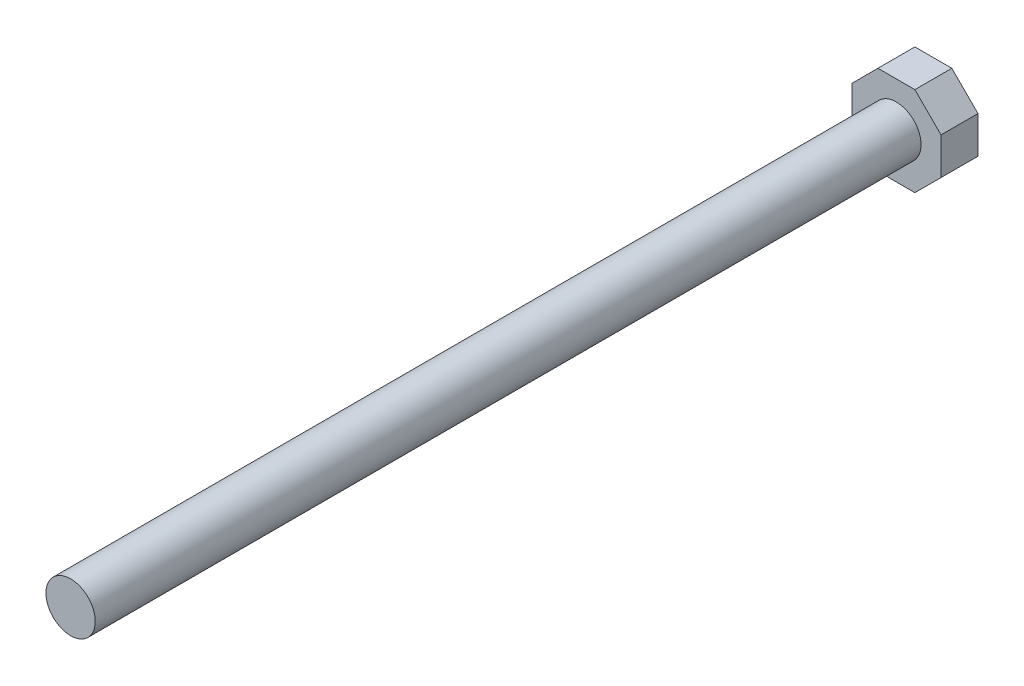
ISO-10303-21;
HEADER;
FILE_DESCRIPTION(('STEP AP214'),'2;1');
FILE_NAME('part.step','',(''),(''),'','','');
FILE_SCHEMA(('AUTOMOTIVE_DESIGN { 1 0 10303 214 1 1 1 1 }'));
ENDSEC;
DATA;
#1=APPLICATION_CONTEXT('core data for automotive mechanical design processes');
#2=APPLICATION_PROTOCOL_DEFINITION('international standard','automotive_design',2000,#1);
#3=PRODUCT_CONTEXT('',#1,'mechanical');
#4=PRODUCT('Part','Part','',(#3));
#5=PRODUCT_RELATED_PRODUCT_CATEGORY('part','',(#4));
#6=PRODUCT_DEFINITION_FORMATION('','',#4);
#7=PRODUCT_DEFINITION_CONTEXT('part definition',#1,'design');
#8=PRODUCT_DEFINITION('design','',#6,#7);
#9=PRODUCT_DEFINITION_SHAPE('','',#8);
#10=(LENGTH_UNIT() NAMED_UNIT(*) SI_UNIT(.MILLI.,.METRE.));
#11=(NAMED_UNIT(*) PLANE_ANGLE_UNIT() SI_UNIT($,.RADIAN.));
#12=(NAMED_UNIT(*) SI_UNIT($,.STERADIAN.) SOLID_ANGLE_UNIT());
#13=UNCERTAINTY_MEASURE_WITH_UNIT(LENGTH_MEASURE(1.E-05),#10,'distance_accuracy_value','');
#14=(GEOMETRIC_REPRESENTATION_CONTEXT(3) GLOBAL_UNCERTAINTY_ASSIGNED_CONTEXT((#13)) GLOBAL_UNIT_ASSIGNED_CONTEXT((#10,
#11,#12)) REPRESENTATION_CONTEXT('',''));
#15=CARTESIAN_POINT('',(0.,0.,0.));
#16=DIRECTION('',(0.,0.,1.));
#17=DIRECTION('',(1.,0.,0.));
#18=AXIS2_PLACEMENT_3D('',#15,#16,#17);
#19=CARTESIAN_POINT('',(-1.77703987317861,-2.71481784594583,3.));
#20=DIRECTION('',(1.,0.,0.));
#21=DIRECTION('',(0.,0.,-1.));
#22=AXIS2_PLACEMENT_3D('',#19,#20,#21);
#23=PLANE('',#22);
#24=DIRECTION('',(0.,-1.,0.));
#25=VECTOR('',#24,1.);
#26=CARTESIAN_POINT('',(-1.77703987317861,-2.71481784594583,0.));
#27=LINE('',#26,#25);
#28=CARTESIAN_POINT('',(-1.77703987317861,0.28518215405417,0.));
#29=VERTEX_POINT('',#28);
#30=CARTESIAN_POINT('',(-1.77703987317861,-2.71481784594583,0.));
#31=VERTEX_POINT('',#30);
#32=EDGE_CURVE('E131',#29,#31,#27,.T.);
#33=ORIENTED_EDGE('',*,*,#32,.T.);
#34=DIRECTION('',(0.,0.,-1.));
#35=VECTOR('',#34,1.);
#36=CARTESIAN_POINT('',(-1.77703987317861,-2.71481784594583,3.));
#37=LINE('',#36,#35);
#38=CARTESIAN_POINT('',(-1.77703987317861,-2.71481784594583,3.));
#39=VERTEX_POINT('',#38);
#40=EDGE_CURVE('E36',#39,#31,#37,.T.);
#41=ORIENTED_EDGE('',*,*,#40,.F.);
#42=DIRECTION('',(0.,-1.,0.));
#43=VECTOR('',#42,1.);
#44=CARTESIAN_POINT('',(-1.77703987317861,-2.71481784594583,3.));
#45=LINE('',#44,#43);
#46=CARTESIAN_POINT('',(-1.77703987317861,0.28518215405417,3.));
#47=VERTEX_POINT('',#46);
#48=EDGE_CURVE('E146',#47,#39,#45,.T.);
#49=ORIENTED_EDGE('',*,*,#48,.F.);
#50=DIRECTION('',(0.,0.,-1.));
#51=VECTOR('',#50,1.);
#52=CARTESIAN_POINT('',(-1.77703987317861,0.28518215405417,3.));
#53=LINE('',#52,#51);
#54=EDGE_CURVE('E127',#47,#29,#53,.T.);
#55=ORIENTED_EDGE('',*,*,#54,.T.);
#56=EDGE_LOOP('',(#33,#41,#49,#55));
#57=FACE_BOUND('',#56,.T.);
#58=ADVANCED_FACE('F33',(#57),#23,.F.);
#59=CARTESIAN_POINT('',(0.34428047038103,-4.83613818950547,3.));
#60=DIRECTION('',(0.707106781186547,0.707106781186547,0.));
#61=DIRECTION('',(-0.707106781186548,0.707106781186548,0.));
#62=AXIS2_PLACEMENT_3D('',#59,#60,#61);
#63=PLANE('',#62);
#64=DIRECTION('',(0.707106781186548,-0.707106781186548,0.));
#65=VECTOR('',#64,1.);
#66=CARTESIAN_POINT('',(0.34428047038103,-4.83613818950547,0.));
#67=LINE('',#66,#65);
#68=CARTESIAN_POINT('',(0.34428047038103,-4.83613818950547,0.));
#69=VERTEX_POINT('',#68);
#70=EDGE_CURVE('E134',#31,#69,#67,.T.);
#71=ORIENTED_EDGE('',*,*,#70,.T.);
#72=DIRECTION('',(0.,0.,-1.));
#73=VECTOR('',#72,1.);
#74=CARTESIAN_POINT('',(0.34428047038103,-4.83613818950547,3.));
#75=LINE('',#74,#73);
#76=CARTESIAN_POINT('',(0.34428047038103,-4.83613818950547,3.));
#77=VERTEX_POINT('',#76);
#78=EDGE_CURVE('E155',#77,#69,#75,.T.);
#79=ORIENTED_EDGE('',*,*,#78,.F.);
#80=DIRECTION('',(0.707106781186548,-0.707106781186548,0.));
#81=VECTOR('',#80,1.);
#82=CARTESIAN_POINT('',(0.34428047038103,-4.83613818950547,3.));
#83=LINE('',#82,#81);
#84=EDGE_CURVE('E94',#39,#77,#83,.T.);
#85=ORIENTED_EDGE('',*,*,#84,.F.);
#86=ORIENTED_EDGE('',*,*,#40,.T.);
#87=EDGE_LOOP('',(#71,#79,#85,#86));
#88=FACE_BOUND('',#87,.T.);
#89=ADVANCED_FACE('F161',(#88),#63,.F.);
#90=CARTESIAN_POINT('',(3.34428047038103,-4.83613818950547,3.));
#91=DIRECTION('',(0.,1.,0.));
#92=DIRECTION('',(0.,0.,1.));
#93=AXIS2_PLACEMENT_3D('',#90,#91,#92);
#94=PLANE('',#93);
#95=DIRECTION('',(1.,0.,0.));
#96=VECTOR('',#95,1.);
#97=CARTESIAN_POINT('',(3.34428047038103,-4.83613818950547,0.));
#98=LINE('',#97,#96);
#99=CARTESIAN_POINT('',(3.34428047038103,-4.83613818950547,0.));
#100=VERTEX_POINT('',#99);
#101=EDGE_CURVE('E137',#69,#100,#98,.T.);
#102=ORIENTED_EDGE('',*,*,#101,.T.);
#103=DIRECTION('',(0.,0.,-1.));
#104=VECTOR('',#103,1.);
#105=CARTESIAN_POINT('',(3.34428047038103,-4.83613818950547,3.));
#106=LINE('',#105,#104);
#107=CARTESIAN_POINT('',(3.34428047038103,-4.83613818950547,3.));
#108=VERTEX_POINT('',#107);
#109=EDGE_CURVE('E153',#108,#100,#106,.T.);
#110=ORIENTED_EDGE('',*,*,#109,.F.);
#111=DIRECTION('',(1.,0.,0.));
#112=VECTOR('',#111,1.);
#113=CARTESIAN_POINT('',(3.34428047038103,-4.83613818950547,3.));
#114=LINE('',#113,#112);
#115=EDGE_CURVE('E176',#77,#108,#114,.T.);
#116=ORIENTED_EDGE('',*,*,#115,.F.);
#117=ORIENTED_EDGE('',*,*,#78,.T.);
#118=EDGE_LOOP('',(#102,#110,#116,#117));
#119=FACE_BOUND('',#118,.T.);
#120=ADVANCED_FACE('F170',(#119),#94,.F.);
#121=CARTESIAN_POINT('',(5.46560081394067,-2.71481784594583,3.));
#122=DIRECTION('',(-0.707106781186548,0.707106781186547,0.));
#123=DIRECTION('',(-0.707106781186547,-0.707106781186548,0.));
#124=AXIS2_PLACEMENT_3D('',#121,#122,#123);
#125=PLANE('',#124);
#126=DIRECTION('',(0.707106781186547,0.707106781186548,0.));
#127=VECTOR('',#126,1.);
#128=CARTESIAN_POINT('',(5.46560081394067,-2.71481784594583,0.));
#129=LINE('',#128,#127);
#130=CARTESIAN_POINT('',(5.46560081394067,-2.71481784594583,0.));
#131=VERTEX_POINT('',#130);
#132=EDGE_CURVE('E139',#100,#131,#129,.T.);
#133=ORIENTED_EDGE('',*,*,#132,.T.);
#134=DIRECTION('',(0.,0.,-1.));
#135=VECTOR('',#134,1.);
#136=CARTESIAN_POINT('',(5.46560081394067,-2.71481784594583,3.));
#137=LINE('',#136,#135);
#138=CARTESIAN_POINT('',(5.46560081394067,-2.71481784594583,3.));
#139=VERTEX_POINT('',#138);
#140=EDGE_CURVE('E150',#139,#131,#137,.T.);
#141=ORIENTED_EDGE('',*,*,#140,.F.);
#142=DIRECTION('',(0.707106781186547,0.707106781186548,0.));
#143=VECTOR('',#142,1.);
#144=CARTESIAN_POINT('',(5.46560081394067,-2.71481784594583,3.));
#145=LINE('',#144,#143);
#146=EDGE_CURVE('E175',#108,#139,#145,.T.);
#147=ORIENTED_EDGE('',*,*,#146,.F.);
#148=ORIENTED_EDGE('',*,*,#109,.T.);
#149=EDGE_LOOP('',(#133,#141,#147,#148));
#150=FACE_BOUND('',#149,.T.);
#151=ADVANCED_FACE('F173',(#150),#125,.F.);
#152=CARTESIAN_POINT('',(5.46560081394067,0.285182154054171,3.));
#153=DIRECTION('',(-1.,0.,0.));
#154=DIRECTION('',(0.,0.,1.));
#155=AXIS2_PLACEMENT_3D('',#152,#153,#154);
#156=PLANE('',#155);
#157=DIRECTION('',(0.,1.,0.));
#158=VECTOR('',#157,1.);
#159=CARTESIAN_POINT('',(5.46560081394067,0.285182154054171,0.));
#160=LINE('',#159,#158);
#161=CARTESIAN_POINT('',(5.46560081394067,0.285182154054171,0.));
#162=VERTEX_POINT('',#161);
#163=EDGE_CURVE('E141',#131,#162,#160,.T.);
#164=ORIENTED_EDGE('',*,*,#163,.T.);
#165=DIRECTION('',(0.,0.,-1.));
#166=VECTOR('',#165,1.);
#167=CARTESIAN_POINT('',(5.46560081394067,0.285182154054171,3.));
#168=LINE('',#167,#166);
#169=CARTESIAN_POINT('',(5.46560081394067,0.285182154054171,3.));
#170=VERTEX_POINT('',#169);
#171=EDGE_CURVE('E122',#170,#162,#168,.T.);
#172=ORIENTED_EDGE('',*,*,#171,.F.);
#173=DIRECTION('',(0.,1.,0.));
#174=VECTOR('',#173,1.);
#175=CARTESIAN_POINT('',(5.46560081394067,0.285182154054171,3.));
#176=LINE('',#175,#174);
#177=EDGE_CURVE('E113',#139,#170,#176,.T.);
#178=ORIENTED_EDGE('',*,*,#177,.F.);
#179=ORIENTED_EDGE('',*,*,#140,.T.);
#180=EDGE_LOOP('',(#164,#172,#178,#179));
#181=FACE_BOUND('',#180,.T.);
#182=ADVANCED_FACE('F213',(#181),#156,.F.);
#183=CARTESIAN_POINT('',(3.34428047038103,2.40650249761381,3.));
#184=DIRECTION('',(-0.707106781186548,-0.707106781186547,0.));
#185=DIRECTION('',(0.707106781186547,-0.707106781186548,0.));
#186=AXIS2_PLACEMENT_3D('',#183,#184,#185);
#187=PLANE('',#186);
#188=DIRECTION('',(-0.707106781186547,0.707106781186548,0.));
#189=VECTOR('',#188,1.);
#190=CARTESIAN_POINT('',(3.34428047038103,2.40650249761381,0.));
#191=LINE('',#190,#189);
#192=CARTESIAN_POINT('',(3.34428047038103,2.40650249761381,0.));
#193=VERTEX_POINT('',#192);
#194=EDGE_CURVE('E121',#162,#193,#191,.T.);
#195=ORIENTED_EDGE('',*,*,#194,.T.);
#196=DIRECTION('',(0.,0.,-1.));
#197=VECTOR('',#196,1.);
#198=CARTESIAN_POINT('',(3.34428047038103,2.40650249761381,3.));
#199=LINE('',#198,#197);
#200=CARTESIAN_POINT('',(3.34428047038103,2.40650249761381,3.));
#201=VERTEX_POINT('',#200);
#202=EDGE_CURVE('E118',#201,#193,#199,.T.);
#203=ORIENTED_EDGE('',*,*,#202,.F.);
#204=DIRECTION('',(-0.707106781186547,0.707106781186548,0.));
#205=VECTOR('',#204,1.);
#206=CARTESIAN_POINT('',(3.34428047038103,2.40650249761381,3.));
#207=LINE('',#206,#205);
#208=EDGE_CURVE('E107',#170,#201,#207,.T.);
#209=ORIENTED_EDGE('',*,*,#208,.F.);
#210=ORIENTED_EDGE('',*,*,#171,.T.);
#211=EDGE_LOOP('',(#195,#203,#209,#210));
#212=FACE_BOUND('',#211,.T.);
#213=ADVANCED_FACE('F119',(#212),#187,.F.);
#214=CARTESIAN_POINT('',(0.34428047038103,2.40650249761381,3.));
#215=DIRECTION('',(0.,-1.,0.));
#216=DIRECTION('',(0.,0.,-1.));
#217=AXIS2_PLACEMENT_3D('',#214,#215,#216);
#218=PLANE('',#217);
#219=DIRECTION('',(-1.,0.,0.));
#220=VECTOR('',#219,1.);
#221=CARTESIAN_POINT('',(0.34428047038103,2.40650249761381,0.));
#222=LINE('',#221,#220);
#223=CARTESIAN_POINT('',(0.34428047038103,2.40650249761381,0.));
#224=VERTEX_POINT('',#223);
#225=EDGE_CURVE('E79',#193,#224,#222,.T.);
#226=ORIENTED_EDGE('',*,*,#225,.T.);
#227=DIRECTION('',(0.,0.,-1.));
#228=VECTOR('',#227,1.);
#229=CARTESIAN_POINT('',(0.34428047038103,2.40650249761381,3.));
#230=LINE('',#229,#228);
#231=CARTESIAN_POINT('',(0.34428047038103,2.40650249761381,3.));
#232=VERTEX_POINT('',#231);
#233=EDGE_CURVE('E123',#232,#224,#230,.T.);
#234=ORIENTED_EDGE('',*,*,#233,.F.);
#235=DIRECTION('',(-1.,0.,0.));
#236=VECTOR('',#235,1.);
#237=CARTESIAN_POINT('',(0.34428047038103,2.40650249761381,3.));
#238=LINE('',#237,#236);
#239=EDGE_CURVE('E111',#201,#232,#238,.T.);
#240=ORIENTED_EDGE('',*,*,#239,.F.);
#241=ORIENTED_EDGE('',*,*,#202,.T.);
#242=EDGE_LOOP('',(#226,#234,#240,#241));
#243=FACE_BOUND('',#242,.T.);
#244=ADVANCED_FACE('F125',(#243),#218,.F.);
#245=CARTESIAN_POINT('',(-1.77703987317861,0.28518215405417,3.));
#246=DIRECTION('',(0.707106781186548,-0.707106781186547,0.));
#247=DIRECTION('',(0.707106781186547,0.707106781186548,0.));
#248=AXIS2_PLACEMENT_3D('',#245,#246,#247);
#249=PLANE('',#248);
#250=DIRECTION('',(-0.707106781186547,-0.707106781186548,0.));
#251=VECTOR('',#250,1.);
#252=CARTESIAN_POINT('',(-1.77703987317861,0.28518215405417,0.));
#253=LINE('',#252,#251);
#254=EDGE_CURVE('E85',#224,#29,#253,.T.);
#255=ORIENTED_EDGE('',*,*,#254,.T.);
#256=ORIENTED_EDGE('',*,*,#54,.F.);
#257=DIRECTION('',(-0.707106781186547,-0.707106781186548,0.));
#258=VECTOR('',#257,1.);
#259=CARTESIAN_POINT('',(-1.77703987317861,0.28518215405417,3.));
#260=LINE('',#259,#258);
#261=EDGE_CURVE('E50',#232,#47,#260,.T.);
#262=ORIENTED_EDGE('',*,*,#261,.F.);
#263=ORIENTED_EDGE('',*,*,#233,.T.);
#264=EDGE_LOOP('',(#255,#256,#262,#263));
#265=FACE_BOUND('',#264,.T.);
#266=ADVANCED_FACE('F194',(#265),#249,.F.);
#267=CARTESIAN_POINT('',(0.,0.,3.));
#268=DIRECTION('',(0.,0.,-1.));
#269=DIRECTION('',(-1.,0.,0.));
#270=AXIS2_PLACEMENT_3D('',#267,#268,#269);
#271=PLANE('',#270);
#272=CARTESIAN_POINT('',(1.84428047038103,-1.21481784594583,3.));
#273=DIRECTION('',(0.,0.,1.));
#274=DIRECTION('',(1.,0.,0.));
#275=AXIS2_PLACEMENT_3D('',#272,#273,#274);
#276=CIRCLE('',#275,2.);
#277=CARTESIAN_POINT('',(3.84428047038103,-1.21481784594583,3.));
#278=VERTEX_POINT('',#277);
#279=EDGE_CURVE('E11',#278,#278,#276,.T.);
#280=ORIENTED_EDGE('',*,*,#279,.F.);
#281=EDGE_LOOP('',(#280));
#282=FACE_BOUND('',#281,.T.);
#283=ORIENTED_EDGE('',*,*,#48,.T.);
#284=ORIENTED_EDGE('',*,*,#84,.T.);
#285=ORIENTED_EDGE('',*,*,#115,.T.);
#286=ORIENTED_EDGE('',*,*,#146,.T.);
#287=ORIENTED_EDGE('',*,*,#177,.T.);
#288=ORIENTED_EDGE('',*,*,#208,.T.);
#289=ORIENTED_EDGE('',*,*,#239,.T.);
#290=ORIENTED_EDGE('',*,*,#261,.T.);
#291=EDGE_LOOP('',(#283,#284,#285,#286,#287,#288,#289,#290));
#292=FACE_BOUND('',#291,.T.);
#293=ADVANCED_FACE('F109',(#282,#292),#271,.F.);
#294=CARTESIAN_POINT('',(0.,0.,0.));
#295=DIRECTION('',(0.,0.,-1.));
#296=DIRECTION('',(-1.,0.,0.));
#297=AXIS2_PLACEMENT_3D('',#294,#295,#296);
#298=PLANE('',#297);
#299=ORIENTED_EDGE('',*,*,#32,.F.);
#300=ORIENTED_EDGE('',*,*,#254,.F.);
#301=ORIENTED_EDGE('',*,*,#225,.F.);
#302=ORIENTED_EDGE('',*,*,#194,.F.);
#303=ORIENTED_EDGE('',*,*,#163,.F.);
#304=ORIENTED_EDGE('',*,*,#132,.F.);
#305=ORIENTED_EDGE('',*,*,#101,.F.);
#306=ORIENTED_EDGE('',*,*,#70,.F.);
#307=EDGE_LOOP('',(#299,#300,#301,#302,#303,#304,#305,#306));
#308=FACE_BOUND('',#307,.T.);
#309=ADVANCED_FACE('F166',(#308),#298,.T.);
#310=CARTESIAN_POINT('',(1.84428047038103,-1.21481784594583,70.));
#311=DIRECTION('',(0.,0.,-1.));
#312=DIRECTION('',(-1.,0.,0.));
#313=AXIS2_PLACEMENT_3D('',#310,#311,#312);
#314=CYLINDRICAL_SURFACE('',#313,2.);
#315=CARTESIAN_POINT('',(1.84428047038103,-1.21481784594583,70.));
#316=DIRECTION('',(0.,0.,1.));
#317=DIRECTION('',(1.,0.,0.));
#318=AXIS2_PLACEMENT_3D('',#315,#316,#317);
#319=CIRCLE('',#318,2.);
#320=CARTESIAN_POINT('',(3.84428047038103,-1.21481784594583,70.));
#321=VERTEX_POINT('',#320);
#322=EDGE_CURVE('E135',#321,#321,#319,.T.);
#323=ORIENTED_EDGE('',*,*,#322,.F.);
#324=EDGE_LOOP('',(#323));
#325=FACE_BOUND('',#324,.T.);
#326=ORIENTED_EDGE('',*,*,#279,.T.);
#327=EDGE_LOOP('',(#326));
#328=FACE_BOUND('',#327,.T.);
#329=ADVANCED_FACE('F187',(#325,#328),#314,.T.);
#330=CARTESIAN_POINT('',(1.84428047038103,-1.21481784594583,70.));
#331=DIRECTION('',(0.,0.,1.));
#332=DIRECTION('',(1.,0.,0.));
#333=AXIS2_PLACEMENT_3D('',#330,#331,#332);
#334=PLANE('',#333);
#335=ORIENTED_EDGE('',*,*,#322,.T.);
#336=EDGE_LOOP('',(#335));
#337=FACE_BOUND('',#336,.T.);
#338=ADVANCED_FACE('F185',(#337),#334,.T.);
#339=CLOSED_SHELL('',(#58,#89,#120,#151,#182,#213,#244,#266,#293,#309,#329,#338));
#340=MANIFOLD_SOLID_BREP('B2',#339);
#341=ADVANCED_BREP_SHAPE_REPRESENTATION('',(#18,#340),#14);
#342=SHAPE_DEFINITION_REPRESENTATION(#9,#341);
ENDSEC;
END-ISO-10303-21;
